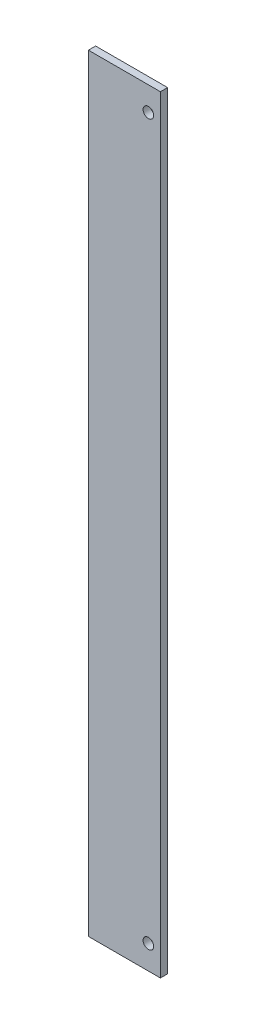
ISO-10303-21;
HEADER;
FILE_DESCRIPTION(('STEP AP214'),'2;1');
FILE_NAME('part.step','',(''),(''),'','','');
FILE_SCHEMA(('AUTOMOTIVE_DESIGN { 1 0 10303 214 1 1 1 1 }'));
ENDSEC;
DATA;
#1=APPLICATION_CONTEXT('core data for automotive mechanical design processes');
#2=APPLICATION_PROTOCOL_DEFINITION('international standard','automotive_design',2000,#1);
#3=PRODUCT_CONTEXT('',#1,'mechanical');
#4=PRODUCT('Part','Part','',(#3));
#5=PRODUCT_RELATED_PRODUCT_CATEGORY('part','',(#4));
#6=PRODUCT_DEFINITION_FORMATION('','',#4);
#7=PRODUCT_DEFINITION_CONTEXT('part definition',#1,'design');
#8=PRODUCT_DEFINITION('design','',#6,#7);
#9=PRODUCT_DEFINITION_SHAPE('','',#8);
#10=(LENGTH_UNIT() NAMED_UNIT(*) SI_UNIT(.MILLI.,.METRE.));
#11=(NAMED_UNIT(*) PLANE_ANGLE_UNIT() SI_UNIT($,.RADIAN.));
#12=(NAMED_UNIT(*) SI_UNIT($,.STERADIAN.) SOLID_ANGLE_UNIT());
#13=UNCERTAINTY_MEASURE_WITH_UNIT(LENGTH_MEASURE(1.E-05),#10,'distance_accuracy_value','');
#14=(GEOMETRIC_REPRESENTATION_CONTEXT(3) GLOBAL_UNCERTAINTY_ASSIGNED_CONTEXT((#13)) GLOBAL_UNIT_ASSIGNED_CONTEXT((#10,
#11,#12)) REPRESENTATION_CONTEXT('',''));
#15=CARTESIAN_POINT('',(0.,0.,0.));
#16=DIRECTION('',(0.,0.,1.));
#17=DIRECTION('',(1.,0.,0.));
#18=AXIS2_PLACEMENT_3D('',#15,#16,#17);
#19=CARTESIAN_POINT('',(65.,165.,3.));
#20=DIRECTION('',(1.,0.,0.));
#21=DIRECTION('',(0.,1.,0.));
#22=AXIS2_PLACEMENT_3D('',#19,#20,#21);
#23=PLANE('',#22);
#24=DIRECTION('',(0.,-1.,0.));
#25=VECTOR('',#24,1.);
#26=CARTESIAN_POINT('',(65.,165.,0.));
#27=LINE('',#26,#25);
#28=CARTESIAN_POINT('',(65.,165.,0.));
#29=VERTEX_POINT('',#28);
#30=CARTESIAN_POINT('',(65.,-155.,0.));
#31=VERTEX_POINT('',#30);
#32=EDGE_CURVE('E102',#29,#31,#27,.T.);
#33=ORIENTED_EDGE('',*,*,#32,.T.);
#34=DIRECTION('',(0.,0.,-1.));
#35=VECTOR('',#34,1.);
#36=CARTESIAN_POINT('',(65.,-155.,3.));
#37=LINE('',#36,#35);
#38=CARTESIAN_POINT('',(65.,-155.,3.));
#39=VERTEX_POINT('',#38);
#40=EDGE_CURVE('E11',#39,#31,#37,.T.);
#41=ORIENTED_EDGE('',*,*,#40,.F.);
#42=DIRECTION('',(0.,-1.,0.));
#43=VECTOR('',#42,1.);
#44=CARTESIAN_POINT('',(65.,165.,3.));
#45=LINE('',#44,#43);
#46=CARTESIAN_POINT('',(65.,165.,3.));
#47=VERTEX_POINT('',#46);
#48=EDGE_CURVE('E90',#47,#39,#45,.T.);
#49=ORIENTED_EDGE('',*,*,#48,.F.);
#50=DIRECTION('',(0.,0.,-1.));
#51=VECTOR('',#50,1.);
#52=CARTESIAN_POINT('',(65.,165.,3.));
#53=LINE('',#52,#51);
#54=EDGE_CURVE('E98',#47,#29,#53,.T.);
#55=ORIENTED_EDGE('',*,*,#54,.T.);
#56=EDGE_LOOP('',(#33,#41,#49,#55));
#57=FACE_BOUND('',#56,.T.);
#58=ADVANCED_FACE('F39',(#57),#23,.F.);
#59=CARTESIAN_POINT('',(95.,-155.,3.));
#60=DIRECTION('',(0.,1.,0.));
#61=DIRECTION('',(0.,0.,1.));
#62=AXIS2_PLACEMENT_3D('',#59,#60,#61);
#63=PLANE('',#62);
#64=DIRECTION('',(1.,0.,0.));
#65=VECTOR('',#64,1.);
#66=CARTESIAN_POINT('',(95.,-155.,0.));
#67=LINE('',#66,#65);
#68=CARTESIAN_POINT('',(95.,-155.,0.));
#69=VERTEX_POINT('',#68);
#70=EDGE_CURVE('E94',#31,#69,#67,.T.);
#71=ORIENTED_EDGE('',*,*,#70,.T.);
#72=DIRECTION('',(0.,0.,-1.));
#73=VECTOR('',#72,1.);
#74=CARTESIAN_POINT('',(95.,-155.,3.));
#75=LINE('',#74,#73);
#76=CARTESIAN_POINT('',(95.,-155.,3.));
#77=VERTEX_POINT('',#76);
#78=EDGE_CURVE('E47',#77,#69,#75,.T.);
#79=ORIENTED_EDGE('',*,*,#78,.F.);
#80=DIRECTION('',(1.,0.,0.));
#81=VECTOR('',#80,1.);
#82=CARTESIAN_POINT('',(95.,-155.,3.));
#83=LINE('',#82,#81);
#84=EDGE_CURVE('E85',#39,#77,#83,.T.);
#85=ORIENTED_EDGE('',*,*,#84,.F.);
#86=ORIENTED_EDGE('',*,*,#40,.T.);
#87=EDGE_LOOP('',(#71,#79,#85,#86));
#88=FACE_BOUND('',#87,.T.);
#89=ADVANCED_FACE('F93',(#88),#63,.F.);
#90=CARTESIAN_POINT('',(95.,165.,3.));
#91=DIRECTION('',(-1.,0.,0.));
#92=DIRECTION('',(0.,-1.,0.));
#93=AXIS2_PLACEMENT_3D('',#90,#91,#92);
#94=PLANE('',#93);
#95=DIRECTION('',(0.,1.,0.));
#96=VECTOR('',#95,1.);
#97=CARTESIAN_POINT('',(95.,165.,0.));
#98=LINE('',#97,#96);
#99=CARTESIAN_POINT('',(95.,165.,0.));
#100=VERTEX_POINT('',#99);
#101=EDGE_CURVE('E72',#69,#100,#98,.T.);
#102=ORIENTED_EDGE('',*,*,#101,.T.);
#103=DIRECTION('',(0.,0.,-1.));
#104=VECTOR('',#103,1.);
#105=CARTESIAN_POINT('',(95.,165.,3.));
#106=LINE('',#105,#104);
#107=CARTESIAN_POINT('',(95.,165.,3.));
#108=VERTEX_POINT('',#107);
#109=EDGE_CURVE('E95',#108,#100,#106,.T.);
#110=ORIENTED_EDGE('',*,*,#109,.F.);
#111=DIRECTION('',(0.,1.,0.));
#112=VECTOR('',#111,1.);
#113=CARTESIAN_POINT('',(95.,165.,3.));
#114=LINE('',#113,#112);
#115=EDGE_CURVE('E88',#77,#108,#114,.T.);
#116=ORIENTED_EDGE('',*,*,#115,.F.);
#117=ORIENTED_EDGE('',*,*,#78,.T.);
#118=EDGE_LOOP('',(#102,#110,#116,#117));
#119=FACE_BOUND('',#118,.T.);
#120=ADVANCED_FACE('F96',(#119),#94,.F.);
#121=CARTESIAN_POINT('',(65.,165.,3.));
#122=DIRECTION('',(0.,-1.,0.));
#123=DIRECTION('',(0.,0.,-1.));
#124=AXIS2_PLACEMENT_3D('',#121,#122,#123);
#125=PLANE('',#124);
#126=DIRECTION('',(-1.,0.,0.));
#127=VECTOR('',#126,1.);
#128=CARTESIAN_POINT('',(65.,165.,0.));
#129=LINE('',#128,#127);
#130=EDGE_CURVE('E78',#100,#29,#129,.T.);
#131=ORIENTED_EDGE('',*,*,#130,.T.);
#132=ORIENTED_EDGE('',*,*,#54,.F.);
#133=DIRECTION('',(-1.,0.,0.));
#134=VECTOR('',#133,1.);
#135=CARTESIAN_POINT('',(65.,165.,3.));
#136=LINE('',#135,#134);
#137=EDGE_CURVE('E55',#108,#47,#136,.T.);
#138=ORIENTED_EDGE('',*,*,#137,.F.);
#139=ORIENTED_EDGE('',*,*,#109,.T.);
#140=EDGE_LOOP('',(#131,#132,#138,#139));
#141=FACE_BOUND('',#140,.T.);
#142=ADVANCED_FACE('F110',(#141),#125,.F.);
#143=CARTESIAN_POINT('',(0.,0.,3.));
#144=DIRECTION('',(0.,0.,-1.));
#145=DIRECTION('',(-1.,0.,0.));
#146=AXIS2_PLACEMENT_3D('',#143,#144,#145);
#147=PLANE('',#146);
#148=CARTESIAN_POINT('',(90.,-145.,3.));
#149=DIRECTION('',(0.,0.,1.));
#150=DIRECTION('',(1.,0.,0.));
#151=AXIS2_PLACEMENT_3D('',#148,#149,#150);
#152=CIRCLE('',#151,2.2);
#153=CARTESIAN_POINT('',(92.2,-145.,3.));
#154=VERTEX_POINT('',#153);
#155=EDGE_CURVE('E105',#154,#154,#152,.T.);
#156=ORIENTED_EDGE('',*,*,#155,.F.);
#157=EDGE_LOOP('',(#156));
#158=FACE_BOUND('',#157,.T.);
#159=CARTESIAN_POINT('',(90.,155.,3.));
#160=DIRECTION('',(0.,0.,1.));
#161=DIRECTION('',(1.,0.,0.));
#162=AXIS2_PLACEMENT_3D('',#159,#160,#161);
#163=CIRCLE('',#162,2.2);
#164=CARTESIAN_POINT('',(92.2,155.,3.));
#165=VERTEX_POINT('',#164);
#166=EDGE_CURVE('E119',#165,#165,#163,.T.);
#167=ORIENTED_EDGE('',*,*,#166,.F.);
#168=EDGE_LOOP('',(#167));
#169=FACE_BOUND('',#168,.T.);
#170=ORIENTED_EDGE('',*,*,#48,.T.);
#171=ORIENTED_EDGE('',*,*,#84,.T.);
#172=ORIENTED_EDGE('',*,*,#115,.T.);
#173=ORIENTED_EDGE('',*,*,#137,.T.);
#174=EDGE_LOOP('',(#170,#171,#172,#173));
#175=FACE_BOUND('',#174,.T.);
#176=ADVANCED_FACE('F86',(#158,#169,#175),#147,.F.);
#177=CARTESIAN_POINT('',(0.,0.,0.));
#178=DIRECTION('',(0.,0.,-1.));
#179=DIRECTION('',(-1.,0.,0.));
#180=AXIS2_PLACEMENT_3D('',#177,#178,#179);
#181=PLANE('',#180);
#182=CARTESIAN_POINT('',(90.,-145.,0.));
#183=DIRECTION('',(0.,0.,-1.));
#184=DIRECTION('',(-1.,0.,0.));
#185=AXIS2_PLACEMENT_3D('',#182,#183,#184);
#186=CIRCLE('',#185,2.2);
#187=CARTESIAN_POINT('',(92.2,-145.,0.));
#188=VERTEX_POINT('',#187);
#189=EDGE_CURVE('E122',#188,#188,#186,.F.);
#190=ORIENTED_EDGE('',*,*,#189,.T.);
#191=EDGE_LOOP('',(#190));
#192=FACE_BOUND('',#191,.T.);
#193=CARTESIAN_POINT('',(90.,155.,0.));
#194=DIRECTION('',(0.,0.,-1.));
#195=DIRECTION('',(-1.,0.,0.));
#196=AXIS2_PLACEMENT_3D('',#193,#194,#195);
#197=CIRCLE('',#196,2.2);
#198=CARTESIAN_POINT('',(92.2,155.,0.));
#199=VERTEX_POINT('',#198);
#200=EDGE_CURVE('E116',#199,#199,#197,.F.);
#201=ORIENTED_EDGE('',*,*,#200,.T.);
#202=EDGE_LOOP('',(#201));
#203=FACE_BOUND('',#202,.T.);
#204=ORIENTED_EDGE('',*,*,#32,.F.);
#205=ORIENTED_EDGE('',*,*,#130,.F.);
#206=ORIENTED_EDGE('',*,*,#101,.F.);
#207=ORIENTED_EDGE('',*,*,#70,.F.);
#208=EDGE_LOOP('',(#204,#205,#206,#207));
#209=FACE_BOUND('',#208,.T.);
#210=ADVANCED_FACE('F113',(#192,#203,#209),#181,.T.);
#211=CARTESIAN_POINT('',(90.,155.,-0.00100000000000013));
#212=DIRECTION('',(0.,0.,1.));
#213=DIRECTION('',(1.,0.,0.));
#214=AXIS2_PLACEMENT_3D('',#211,#212,#213);
#215=CYLINDRICAL_SURFACE('',#214,2.2);
#216=CARTESIAN_POINT('',(92.2,155.,0.));
#217=CARTESIAN_POINT('',(92.2,155.,0.03125));
#218=CARTESIAN_POINT('',(92.2,155.,0.0625));
#219=CARTESIAN_POINT('',(92.2,155.,0.125));
#220=CARTESIAN_POINT('',(92.2,155.,0.15625));
#221=CARTESIAN_POINT('',(92.2,155.,0.21875));
#222=CARTESIAN_POINT('',(92.2,155.,0.25));
#223=CARTESIAN_POINT('',(92.2,155.,0.3125));
#224=CARTESIAN_POINT('',(92.2,155.,0.34375));
#225=CARTESIAN_POINT('',(92.2,155.,0.40625));
#226=CARTESIAN_POINT('',(92.2,155.,0.4375));
#227=CARTESIAN_POINT('',(92.2,155.,0.5));
#228=CARTESIAN_POINT('',(92.2,155.,0.53125));
#229=CARTESIAN_POINT('',(92.2,155.,0.59375));
#230=CARTESIAN_POINT('',(92.2,155.,0.625));
#231=CARTESIAN_POINT('',(92.2,155.,0.6875));
#232=CARTESIAN_POINT('',(92.2,155.,0.71875));
#233=CARTESIAN_POINT('',(92.2,155.,0.78125));
#234=CARTESIAN_POINT('',(92.2,155.,0.8125));
#235=CARTESIAN_POINT('',(92.2,155.,0.875));
#236=CARTESIAN_POINT('',(92.2,155.,0.90625));
#237=CARTESIAN_POINT('',(92.2,155.,0.96875));
#238=CARTESIAN_POINT('',(92.2,155.,1.));
#239=CARTESIAN_POINT('',(92.2,155.,1.0625));
#240=CARTESIAN_POINT('',(92.2,155.,1.09375));
#241=CARTESIAN_POINT('',(92.2,155.,1.15625));
#242=CARTESIAN_POINT('',(92.2,155.,1.1875));
#243=CARTESIAN_POINT('',(92.2,155.,1.25));
#244=CARTESIAN_POINT('',(92.2,155.,1.28125));
#245=CARTESIAN_POINT('',(92.2,155.,1.34375));
#246=CARTESIAN_POINT('',(92.2,155.,1.375));
#247=CARTESIAN_POINT('',(92.2,155.,1.4375));
#248=CARTESIAN_POINT('',(92.2,155.,1.46875));
#249=CARTESIAN_POINT('',(92.2,155.,1.53125));
#250=CARTESIAN_POINT('',(92.2,155.,1.5625));
#251=CARTESIAN_POINT('',(92.2,155.,1.625));
#252=CARTESIAN_POINT('',(92.2,155.,1.65625));
#253=CARTESIAN_POINT('',(92.2,155.,1.71875));
#254=CARTESIAN_POINT('',(92.2,155.,1.75));
#255=CARTESIAN_POINT('',(92.2,155.,1.8125));
#256=CARTESIAN_POINT('',(92.2,155.,1.84375));
#257=CARTESIAN_POINT('',(92.2,155.,1.90625));
#258=CARTESIAN_POINT('',(92.2,155.,1.9375));
#259=CARTESIAN_POINT('',(92.2,155.,2.));
#260=CARTESIAN_POINT('',(92.2,155.,2.03125));
#261=CARTESIAN_POINT('',(92.2,155.,2.09375));
#262=CARTESIAN_POINT('',(92.2,155.,2.125));
#263=CARTESIAN_POINT('',(92.2,155.,2.1875));
#264=CARTESIAN_POINT('',(92.2,155.,2.21875));
#265=CARTESIAN_POINT('',(92.2,155.,2.28125));
#266=CARTESIAN_POINT('',(92.2,155.,2.3125));
#267=CARTESIAN_POINT('',(92.2,155.,2.375));
#268=CARTESIAN_POINT('',(92.2,155.,2.40625));
#269=CARTESIAN_POINT('',(92.2,155.,2.46875));
#270=CARTESIAN_POINT('',(92.2,155.,2.5));
#271=CARTESIAN_POINT('',(92.2,155.,2.5625));
#272=CARTESIAN_POINT('',(92.2,155.,2.59375));
#273=CARTESIAN_POINT('',(92.2,155.,2.65625));
#274=CARTESIAN_POINT('',(92.2,155.,2.6875));
#275=CARTESIAN_POINT('',(92.2,155.,2.75));
#276=CARTESIAN_POINT('',(92.2,155.,2.78125));
#277=CARTESIAN_POINT('',(92.2,155.,2.84375));
#278=CARTESIAN_POINT('',(92.2,155.,2.875));
#279=CARTESIAN_POINT('',(92.2,155.,2.9375));
#280=CARTESIAN_POINT('',(92.2,155.,2.96875));
#281=CARTESIAN_POINT('',(92.2,155.,3.));
#282=B_SPLINE_CURVE_WITH_KNOTS('',3,(#216,#217,#218,#219,#220,#221,#222,#223,#224,#225,#226,
#227,#228,#229,#230,#231,#232,#233,#234,#235,#236,#237,#238,#239,#240,#241,#242,#243,#244,#245,
#246,#247,#248,#249,#250,#251,#252,#253,#254,#255,#256,#257,#258,#259,#260,#261,#262,#263,#264,
#265,#266,#267,#268,#269,#270,#271,#272,#273,#274,#275,#276,#277,#278,#279,#280,#281),
.UNSPECIFIED.,.F.,.F.,(4,2,2,2,2,2,2,2,2,2,2,2,2,2,2,2,2,2,2,2,2,2,2,2,2,2,2,2,2,2,2,2,4),(0.,
0.09375,0.1875,0.28125,0.375,0.46875,0.5625,0.65625,0.75,0.84375,0.9375,1.03125,1.125,1.21875,
1.3125,1.40625,1.5,1.59375,1.6875,1.78125,1.875,1.96875,2.0625,2.15625,2.25,2.34375,2.4375,
2.53125,2.625,2.71875,2.8125,2.90625,3.),.UNSPECIFIED.);
#283=EDGE_CURVE('BSEAM135',#199,#165,#282,.T.);
#284=ORIENTED_EDGE('',*,*,#200,.F.);
#285=ORIENTED_EDGE('',*,*,#166,.T.);
#286=ORIENTED_EDGE('',*,*,#283,.T.);
#287=ORIENTED_EDGE('',*,*,#283,.F.);
#288=EDGE_LOOP('',(#284,#286,#285,#287));
#289=FACE_BOUND('',#288,.T.);
#290=ADVANCED_FACE('F135',(#289),#215,.F.);
#291=CARTESIAN_POINT('',(90.,-145.,-0.00100000000000013));
#292=DIRECTION('',(0.,0.,1.));
#293=DIRECTION('',(1.,0.,0.));
#294=AXIS2_PLACEMENT_3D('',#291,#292,#293);
#295=CYLINDRICAL_SURFACE('',#294,2.2);
#296=CARTESIAN_POINT('',(92.2,-145.,0.));
#297=CARTESIAN_POINT('',(92.2,-145.,0.03125));
#298=CARTESIAN_POINT('',(92.2,-145.,0.0625));
#299=CARTESIAN_POINT('',(92.2,-145.,0.125));
#300=CARTESIAN_POINT('',(92.2,-145.,0.15625));
#301=CARTESIAN_POINT('',(92.2,-145.,0.21875));
#302=CARTESIAN_POINT('',(92.2,-145.,0.25));
#303=CARTESIAN_POINT('',(92.2,-145.,0.3125));
#304=CARTESIAN_POINT('',(92.2,-145.,0.34375));
#305=CARTESIAN_POINT('',(92.2,-145.,0.40625));
#306=CARTESIAN_POINT('',(92.2,-145.,0.4375));
#307=CARTESIAN_POINT('',(92.2,-145.,0.5));
#308=CARTESIAN_POINT('',(92.2,-145.,0.53125));
#309=CARTESIAN_POINT('',(92.2,-145.,0.59375));
#310=CARTESIAN_POINT('',(92.2,-145.,0.625));
#311=CARTESIAN_POINT('',(92.2,-145.,0.6875));
#312=CARTESIAN_POINT('',(92.2,-145.,0.71875));
#313=CARTESIAN_POINT('',(92.2,-145.,0.78125));
#314=CARTESIAN_POINT('',(92.2,-145.,0.8125));
#315=CARTESIAN_POINT('',(92.2,-145.,0.875));
#316=CARTESIAN_POINT('',(92.2,-145.,0.90625));
#317=CARTESIAN_POINT('',(92.2,-145.,0.96875));
#318=CARTESIAN_POINT('',(92.2,-145.,1.));
#319=CARTESIAN_POINT('',(92.2,-145.,1.0625));
#320=CARTESIAN_POINT('',(92.2,-145.,1.09375));
#321=CARTESIAN_POINT('',(92.2,-145.,1.15625));
#322=CARTESIAN_POINT('',(92.2,-145.,1.1875));
#323=CARTESIAN_POINT('',(92.2,-145.,1.25));
#324=CARTESIAN_POINT('',(92.2,-145.,1.28125));
#325=CARTESIAN_POINT('',(92.2,-145.,1.34375));
#326=CARTESIAN_POINT('',(92.2,-145.,1.375));
#327=CARTESIAN_POINT('',(92.2,-145.,1.4375));
#328=CARTESIAN_POINT('',(92.2,-145.,1.46875));
#329=CARTESIAN_POINT('',(92.2,-145.,1.53125));
#330=CARTESIAN_POINT('',(92.2,-145.,1.5625));
#331=CARTESIAN_POINT('',(92.2,-145.,1.625));
#332=CARTESIAN_POINT('',(92.2,-145.,1.65625));
#333=CARTESIAN_POINT('',(92.2,-145.,1.71875));
#334=CARTESIAN_POINT('',(92.2,-145.,1.75));
#335=CARTESIAN_POINT('',(92.2,-145.,1.8125));
#336=CARTESIAN_POINT('',(92.2,-145.,1.84375));
#337=CARTESIAN_POINT('',(92.2,-145.,1.90625));
#338=CARTESIAN_POINT('',(92.2,-145.,1.9375));
#339=CARTESIAN_POINT('',(92.2,-145.,2.));
#340=CARTESIAN_POINT('',(92.2,-145.,2.03125));
#341=CARTESIAN_POINT('',(92.2,-145.,2.09375));
#342=CARTESIAN_POINT('',(92.2,-145.,2.125));
#343=CARTESIAN_POINT('',(92.2,-145.,2.1875));
#344=CARTESIAN_POINT('',(92.2,-145.,2.21875));
#345=CARTESIAN_POINT('',(92.2,-145.,2.28125));
#346=CARTESIAN_POINT('',(92.2,-145.,2.3125));
#347=CARTESIAN_POINT('',(92.2,-145.,2.375));
#348=CARTESIAN_POINT('',(92.2,-145.,2.40625));
#349=CARTESIAN_POINT('',(92.2,-145.,2.46875));
#350=CARTESIAN_POINT('',(92.2,-145.,2.5));
#351=CARTESIAN_POINT('',(92.2,-145.,2.5625));
#352=CARTESIAN_POINT('',(92.2,-145.,2.59375));
#353=CARTESIAN_POINT('',(92.2,-145.,2.65625));
#354=CARTESIAN_POINT('',(92.2,-145.,2.6875));
#355=CARTESIAN_POINT('',(92.2,-145.,2.75));
#356=CARTESIAN_POINT('',(92.2,-145.,2.78125));
#357=CARTESIAN_POINT('',(92.2,-145.,2.84375));
#358=CARTESIAN_POINT('',(92.2,-145.,2.875));
#359=CARTESIAN_POINT('',(92.2,-145.,2.9375));
#360=CARTESIAN_POINT('',(92.2,-145.,2.96875));
#361=CARTESIAN_POINT('',(92.2,-145.,3.));
#362=B_SPLINE_CURVE_WITH_KNOTS('',3,(#296,#297,#298,#299,#300,#301,#302,#303,#304,#305,#306,
#307,#308,#309,#310,#311,#312,#313,#314,#315,#316,#317,#318,#319,#320,#321,#322,#323,#324,#325,
#326,#327,#328,#329,#330,#331,#332,#333,#334,#335,#336,#337,#338,#339,#340,#341,#342,#343,#344,
#345,#346,#347,#348,#349,#350,#351,#352,#353,#354,#355,#356,#357,#358,#359,#360,#361),
.UNSPECIFIED.,.F.,.F.,(4,2,2,2,2,2,2,2,2,2,2,2,2,2,2,2,2,2,2,2,2,2,2,2,2,2,2,2,2,2,2,2,4),(0.,
0.09375,0.1875,0.28125,0.375,0.46875,0.5625,0.65625,0.75,0.84375,0.9375,1.03125,1.125,1.21875,
1.3125,1.40625,1.5,1.59375,1.6875,1.78125,1.875,1.96875,2.0625,2.15625,2.25,2.34375,2.4375,
2.53125,2.625,2.71875,2.8125,2.90625,3.),.UNSPECIFIED.);
#363=EDGE_CURVE('BSEAM128',#188,#154,#362,.T.);
#364=ORIENTED_EDGE('',*,*,#189,.F.);
#365=ORIENTED_EDGE('',*,*,#155,.T.);
#366=ORIENTED_EDGE('',*,*,#363,.T.);
#367=ORIENTED_EDGE('',*,*,#363,.F.);
#368=EDGE_LOOP('',(#364,#366,#365,#367));
#369=FACE_BOUND('',#368,.T.);
#370=ADVANCED_FACE('F128',(#369),#295,.F.);
#371=CLOSED_SHELL('',(#58,#89,#120,#142,#176,#210,#290,#370));
#372=MANIFOLD_SOLID_BREP('B2',#371);
#373=ADVANCED_BREP_SHAPE_REPRESENTATION('',(#18,#372),#14);
#374=SHAPE_DEFINITION_REPRESENTATION(#9,#373);
ENDSEC;
END-ISO-10303-21;
